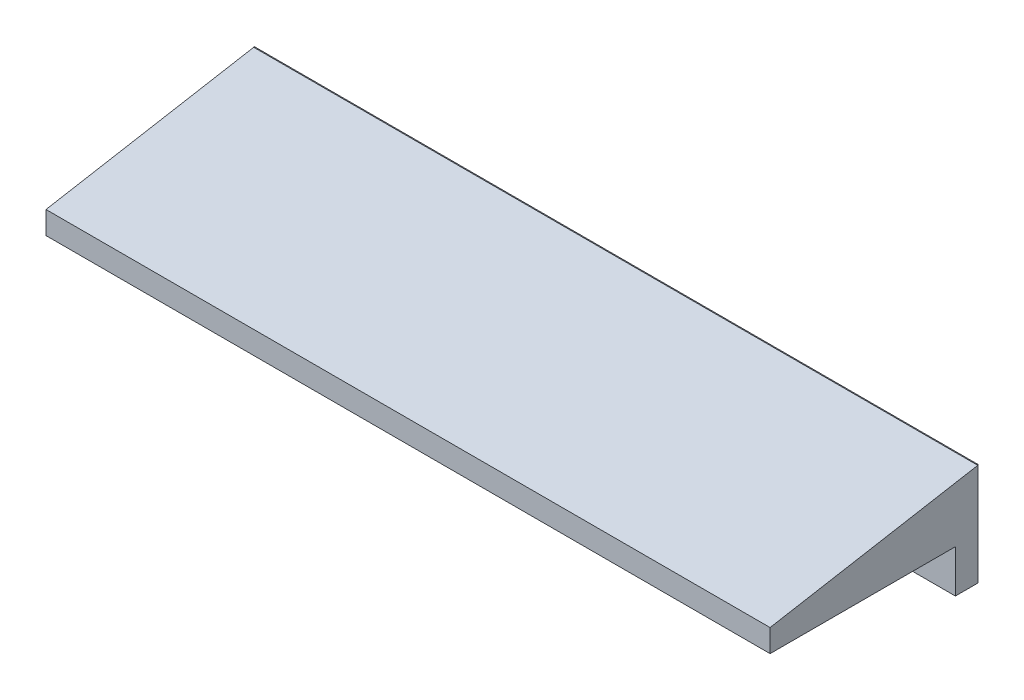
ISO-10303-21;
HEADER;
FILE_DESCRIPTION(('STEP AP214'),'2;1');
FILE_NAME('part.step','',(''),(''),'','','');
FILE_SCHEMA(('AUTOMOTIVE_DESIGN { 1 0 10303 214 1 1 1 1 }'));
ENDSEC;
DATA;
#1=APPLICATION_CONTEXT('core data for automotive mechanical design processes');
#2=APPLICATION_PROTOCOL_DEFINITION('international standard','automotive_design',2000,#1);
#3=PRODUCT_CONTEXT('',#1,'mechanical');
#4=PRODUCT('Part','Part','',(#3));
#5=PRODUCT_RELATED_PRODUCT_CATEGORY('part','',(#4));
#6=PRODUCT_DEFINITION_FORMATION('','',#4);
#7=PRODUCT_DEFINITION_CONTEXT('part definition',#1,'design');
#8=PRODUCT_DEFINITION('design','',#6,#7);
#9=PRODUCT_DEFINITION_SHAPE('','',#8);
#10=(LENGTH_UNIT() NAMED_UNIT(*) SI_UNIT(.MILLI.,.METRE.));
#11=(NAMED_UNIT(*) PLANE_ANGLE_UNIT() SI_UNIT($,.RADIAN.));
#12=(NAMED_UNIT(*) SI_UNIT($,.STERADIAN.) SOLID_ANGLE_UNIT());
#13=UNCERTAINTY_MEASURE_WITH_UNIT(LENGTH_MEASURE(1.E-05),#10,'distance_accuracy_value','');
#14=(GEOMETRIC_REPRESENTATION_CONTEXT(3) GLOBAL_UNCERTAINTY_ASSIGNED_CONTEXT((#13)) GLOBAL_UNIT_ASSIGNED_CONTEXT((#10,
#11,#12)) REPRESENTATION_CONTEXT('',''));
#15=CARTESIAN_POINT('',(0.,0.,0.));
#16=DIRECTION('',(0.,0.,1.));
#17=DIRECTION('',(1.,0.,0.));
#18=AXIS2_PLACEMENT_3D('',#15,#16,#17);
#19=CARTESIAN_POINT('',(50.8,3.175,13.));
#20=DIRECTION('',(-1.,0.,0.));
#21=DIRECTION('',(0.,0.,1.));
#22=AXIS2_PLACEMENT_3D('',#19,#20,#21);
#23=PLANE('',#22);
#24=DIRECTION('',(0.,0.,-1.));
#25=VECTOR('',#24,1.);
#26=CARTESIAN_POINT('',(50.8,0.,13.));
#27=LINE('',#26,#25);
#28=CARTESIAN_POINT('',(50.8,0.,13.));
#29=VERTEX_POINT('',#28);
#30=CARTESIAN_POINT('',(50.8,0.,-13.));
#31=VERTEX_POINT('',#30);
#32=EDGE_CURVE('E80',#29,#31,#27,.T.);
#33=ORIENTED_EDGE('',*,*,#32,.T.);
#34=DIRECTION('',(0.,-1.,0.));
#35=VECTOR('',#34,1.);
#36=CARTESIAN_POINT('',(50.8,3.175,-13.));
#37=LINE('',#36,#35);
#38=CARTESIAN_POINT('',(50.8,-6.,-13.));
#39=VERTEX_POINT('',#38);
#40=EDGE_CURVE('E151',#31,#39,#37,.T.);
#41=ORIENTED_EDGE('',*,*,#40,.T.);
#42=DIRECTION('',(0.,0.,1.));
#43=VECTOR('',#42,1.);
#44=CARTESIAN_POINT('',(50.8,-6.,-16.175));
#45=LINE('',#44,#43);
#46=CARTESIAN_POINT('',(50.8,-6.,-16.175));
#47=VERTEX_POINT('',#46);
#48=EDGE_CURVE('E156',#47,#39,#45,.T.);
#49=ORIENTED_EDGE('',*,*,#48,.F.);
#50=DIRECTION('',(0.,-1.,0.));
#51=VECTOR('',#50,1.);
#52=CARTESIAN_POINT('',(50.8,3.175,-16.175));
#53=LINE('',#52,#51);
#54=CARTESIAN_POINT('',(50.8,8.41281224100232,-16.175));
#55=VERTEX_POINT('',#54);
#56=EDGE_CURVE('E142',#55,#47,#53,.T.);
#57=ORIENTED_EDGE('',*,*,#56,.F.);
#58=DIRECTION('',(0.,-0.952140320589897,0.30566126661219));
#59=VECTOR('',#58,1.);
#60=CARTESIAN_POINT('',(50.8,-3.9214502993643,-12.2153879246706));
#61=LINE('',#60,#59);
#62=CARTESIAN_POINT('',(50.8,8.3137311317087,-16.1431924431629));
#63=VERTEX_POINT('',#62);
#64=EDGE_CURVE('E111',#55,#63,#61,.T.);
#65=ORIENTED_EDGE('',*,*,#64,.T.);
#66=DIRECTION('',(0.,0.173648177666931,-0.984807753012208));
#67=VECTOR('',#66,1.);
#68=CARTESIAN_POINT('',(50.8,5.30239296711449,0.934954942421101));
#69=LINE('',#68,#67);
#70=CARTESIAN_POINT('',(50.8,3.175,13.));
#71=VERTEX_POINT('',#70);
#72=EDGE_CURVE('E91',#71,#63,#69,.T.);
#73=ORIENTED_EDGE('',*,*,#72,.F.);
#74=DIRECTION('',(0.,-1.,0.));
#75=VECTOR('',#74,1.);
#76=CARTESIAN_POINT('',(50.8,3.175,13.));
#77=LINE('',#76,#75);
#78=EDGE_CURVE('E42',#71,#29,#77,.T.);
#79=ORIENTED_EDGE('',*,*,#78,.T.);
#80=EDGE_LOOP('',(#33,#41,#49,#57,#65,#73,#79));
#81=FACE_BOUND('',#80,.T.);
#82=ADVANCED_FACE('F34',(#81),#23,.F.);
#83=CARTESIAN_POINT('',(-50.8,3.175,13.));
#84=DIRECTION('',(1.,0.,0.));
#85=DIRECTION('',(0.,0.,-1.));
#86=AXIS2_PLACEMENT_3D('',#83,#84,#85);
#87=PLANE('',#86);
#88=DIRECTION('',(0.,0.,1.));
#89=VECTOR('',#88,1.);
#90=CARTESIAN_POINT('',(-50.8,0.,13.));
#91=LINE('',#90,#89);
#92=CARTESIAN_POINT('',(-50.8,0.,-13.));
#93=VERTEX_POINT('',#92);
#94=CARTESIAN_POINT('',(-50.8,0.,13.));
#95=VERTEX_POINT('',#94);
#96=EDGE_CURVE('E59',#93,#95,#91,.T.);
#97=ORIENTED_EDGE('',*,*,#96,.T.);
#98=DIRECTION('',(0.,-1.,0.));
#99=VECTOR('',#98,1.);
#100=CARTESIAN_POINT('',(-50.8,3.175,13.));
#101=LINE('',#100,#99);
#102=CARTESIAN_POINT('',(-50.8,3.175,13.));
#103=VERTEX_POINT('',#102);
#104=EDGE_CURVE('E11',#103,#95,#101,.T.);
#105=ORIENTED_EDGE('',*,*,#104,.F.);
#106=DIRECTION('',(0.,0.173648177666931,-0.984807753012208));
#107=VECTOR('',#106,1.);
#108=CARTESIAN_POINT('',(-50.8,5.30239296711449,0.934954942421101));
#109=LINE('',#108,#107);
#110=CARTESIAN_POINT('',(-50.8,8.3137311317087,-16.1431924431629));
#111=VERTEX_POINT('',#110);
#112=EDGE_CURVE('E98',#103,#111,#109,.T.);
#113=ORIENTED_EDGE('',*,*,#112,.T.);
#114=DIRECTION('',(0.,-0.952140320589897,0.30566126661219));
#115=VECTOR('',#114,1.);
#116=CARTESIAN_POINT('',(-50.8,-3.9214502993643,-12.2153879246706));
#117=LINE('',#116,#115);
#118=CARTESIAN_POINT('',(-50.8,8.41281224100232,-16.175));
#119=VERTEX_POINT('',#118);
#120=EDGE_CURVE('E105',#119,#111,#117,.T.);
#121=ORIENTED_EDGE('',*,*,#120,.F.);
#122=DIRECTION('',(0.,1.,0.));
#123=VECTOR('',#122,1.);
#124=CARTESIAN_POINT('',(-50.8,3.175,-16.175));
#125=LINE('',#124,#123);
#126=CARTESIAN_POINT('',(-50.8,-5.99999999999999,-16.175));
#127=VERTEX_POINT('',#126);
#128=EDGE_CURVE('E139',#127,#119,#125,.T.);
#129=ORIENTED_EDGE('',*,*,#128,.F.);
#130=DIRECTION('',(0.,0.,1.));
#131=VECTOR('',#130,1.);
#132=CARTESIAN_POINT('',(-50.8,-5.99999999999999,-16.175));
#133=LINE('',#132,#131);
#134=CARTESIAN_POINT('',(-50.8,-5.99999999999999,-13.));
#135=VERTEX_POINT('',#134);
#136=EDGE_CURVE('E149',#127,#135,#133,.T.);
#137=ORIENTED_EDGE('',*,*,#136,.T.);
#138=DIRECTION('',(0.,1.,0.));
#139=VECTOR('',#138,1.);
#140=CARTESIAN_POINT('',(-50.8,3.175,-13.));
#141=LINE('',#140,#139);
#142=EDGE_CURVE('E63',#135,#93,#141,.T.);
#143=ORIENTED_EDGE('',*,*,#142,.T.);
#144=EDGE_LOOP('',(#97,#105,#113,#121,#129,#137,#143));
#145=FACE_BOUND('',#144,.T.);
#146=ADVANCED_FACE('F60',(#145),#87,.F.);
#147=CARTESIAN_POINT('',(-50.8,3.175,13.));
#148=DIRECTION('',(0.,0.,-1.));
#149=DIRECTION('',(-1.,0.,0.));
#150=AXIS2_PLACEMENT_3D('',#147,#148,#149);
#151=PLANE('',#150);
#152=DIRECTION('',(1.,0.,0.));
#153=VECTOR('',#152,1.);
#154=CARTESIAN_POINT('',(-50.8,0.,13.));
#155=LINE('',#154,#153);
#156=EDGE_CURVE('E67',#95,#29,#155,.T.);
#157=ORIENTED_EDGE('',*,*,#156,.T.);
#158=ORIENTED_EDGE('',*,*,#78,.F.);
#159=DIRECTION('',(1.,0.,0.));
#160=VECTOR('',#159,1.);
#161=CARTESIAN_POINT('',(-50.8,3.175,13.));
#162=LINE('',#161,#160);
#163=EDGE_CURVE('E75',#103,#71,#162,.T.);
#164=ORIENTED_EDGE('',*,*,#163,.F.);
#165=ORIENTED_EDGE('',*,*,#104,.T.);
#166=EDGE_LOOP('',(#157,#158,#164,#165));
#167=FACE_BOUND('',#166,.T.);
#168=ADVANCED_FACE('F71',(#167),#151,.F.);
#169=CARTESIAN_POINT('',(0.,0.,0.));
#170=DIRECTION('',(0.,-1.,0.));
#171=DIRECTION('',(0.,0.,-1.));
#172=AXIS2_PLACEMENT_3D('',#169,#170,#171);
#173=PLANE('',#172);
#174=ORIENTED_EDGE('',*,*,#32,.F.);
#175=ORIENTED_EDGE('',*,*,#156,.F.);
#176=ORIENTED_EDGE('',*,*,#96,.F.);
#177=DIRECTION('',(-1.,0.,0.));
#178=VECTOR('',#177,1.);
#179=CARTESIAN_POINT('',(-50.8,0.,-13.));
#180=LINE('',#179,#178);
#181=EDGE_CURVE('E68',#31,#93,#180,.T.);
#182=ORIENTED_EDGE('',*,*,#181,.F.);
#183=EDGE_LOOP('',(#174,#175,#176,#182));
#184=FACE_BOUND('',#183,.T.);
#185=ADVANCED_FACE('F78',(#184),#173,.T.);
#186=CARTESIAN_POINT('',(-50.8,-5.99999999999999,-16.175));
#187=DIRECTION('',(0.,1.,0.));
#188=DIRECTION('',(-1.,0.,0.));
#189=AXIS2_PLACEMENT_3D('',#186,#187,#188);
#190=PLANE('',#189);
#191=DIRECTION('',(-1.,0.,0.));
#192=VECTOR('',#191,1.);
#193=CARTESIAN_POINT('',(-50.8,-5.99999999999999,-13.));
#194=LINE('',#193,#192);
#195=EDGE_CURVE('E143',#39,#135,#194,.T.);
#196=ORIENTED_EDGE('',*,*,#195,.T.);
#197=ORIENTED_EDGE('',*,*,#136,.F.);
#198=DIRECTION('',(-1.,0.,0.));
#199=VECTOR('',#198,1.);
#200=CARTESIAN_POINT('',(-50.8,-5.99999999999999,-16.175));
#201=LINE('',#200,#199);
#202=EDGE_CURVE('E146',#47,#127,#201,.T.);
#203=ORIENTED_EDGE('',*,*,#202,.F.);
#204=ORIENTED_EDGE('',*,*,#48,.T.);
#205=EDGE_LOOP('',(#196,#197,#203,#204));
#206=FACE_BOUND('',#205,.T.);
#207=ADVANCED_FACE('F173',(#206),#190,.F.);
#208=CARTESIAN_POINT('',(0.,0.,-16.175));
#209=DIRECTION('',(0.,0.,1.));
#210=DIRECTION('',(1.,0.,0.));
#211=AXIS2_PLACEMENT_3D('',#208,#209,#210);
#212=PLANE('',#211);
#213=CARTESIAN_POINT('',(-43.9685,-3.00000000000001,-16.175));
#214=DIRECTION('',(0.,0.,1.));
#215=DIRECTION('',(1.,0.,0.));
#216=AXIS2_PLACEMENT_3D('',#213,#214,#215);
#217=CIRCLE('',#216,1.6);
#218=CARTESIAN_POINT('',(-42.3685,-3.00000000000001,-16.175));
#219=VERTEX_POINT('',#218);
#220=EDGE_CURVE('E116',#219,#219,#217,.T.);
#221=ORIENTED_EDGE('',*,*,#220,.T.);
#222=EDGE_LOOP('',(#221));
#223=FACE_BOUND('',#222,.T.);
#224=CARTESIAN_POINT('',(30.3075,-3.,-16.175));
#225=DIRECTION('',(0.,0.,1.));
#226=DIRECTION('',(1.,0.,0.));
#227=AXIS2_PLACEMENT_3D('',#224,#225,#226);
#228=CIRCLE('',#227,1.6);
#229=CARTESIAN_POINT('',(31.9075,-3.,-16.175));
#230=VERTEX_POINT('',#229);
#231=EDGE_CURVE('E114',#230,#230,#228,.T.);
#232=ORIENTED_EDGE('',*,*,#231,.T.);
#233=EDGE_LOOP('',(#232));
#234=FACE_BOUND('',#233,.T.);
#235=CARTESIAN_POINT('',(43.9685,-3.,-16.175));
#236=DIRECTION('',(0.,0.,1.));
#237=DIRECTION('',(1.,0.,0.));
#238=AXIS2_PLACEMENT_3D('',#235,#236,#237);
#239=CIRCLE('',#238,1.6);
#240=CARTESIAN_POINT('',(45.5685,-3.,-16.175));
#241=VERTEX_POINT('',#240);
#242=EDGE_CURVE('E126',#241,#241,#239,.T.);
#243=ORIENTED_EDGE('',*,*,#242,.T.);
#244=EDGE_LOOP('',(#243));
#245=FACE_BOUND('',#244,.T.);
#246=CARTESIAN_POINT('',(-30.3075,-3.00000000000001,-16.175));
#247=DIRECTION('',(0.,0.,1.));
#248=DIRECTION('',(1.,0.,0.));
#249=AXIS2_PLACEMENT_3D('',#246,#247,#248);
#250=CIRCLE('',#249,1.6);
#251=CARTESIAN_POINT('',(-28.7075,-3.00000000000001,-16.175));
#252=VERTEX_POINT('',#251);
#253=EDGE_CURVE('E131',#252,#252,#250,.T.);
#254=ORIENTED_EDGE('',*,*,#253,.T.);
#255=EDGE_LOOP('',(#254));
#256=FACE_BOUND('',#255,.T.);
#257=ORIENTED_EDGE('',*,*,#128,.T.);
#258=DIRECTION('',(1.,0.,0.));
#259=VECTOR('',#258,1.);
#260=CARTESIAN_POINT('',(-50.8,8.41281224100232,-16.175));
#261=LINE('',#260,#259);
#262=EDGE_CURVE('E104',#119,#55,#261,.T.);
#263=ORIENTED_EDGE('',*,*,#262,.T.);
#264=ORIENTED_EDGE('',*,*,#56,.T.);
#265=ORIENTED_EDGE('',*,*,#202,.T.);
#266=EDGE_LOOP('',(#257,#263,#264,#265));
#267=FACE_BOUND('',#266,.T.);
#268=ADVANCED_FACE('F177',(#223,#234,#245,#256,#267),#212,.F.);
#269=CARTESIAN_POINT('',(0.,0.,-13.));
#270=DIRECTION('',(0.,0.,1.));
#271=DIRECTION('',(1.,0.,0.));
#272=AXIS2_PLACEMENT_3D('',#269,#270,#271);
#273=PLANE('',#272);
#274=CARTESIAN_POINT('',(-43.9685,-3.00000000000001,-13.));
#275=DIRECTION('',(0.,0.,1.));
#276=DIRECTION('',(1.,0.,0.));
#277=AXIS2_PLACEMENT_3D('',#274,#275,#276);
#278=CIRCLE('',#277,1.6);
#279=CARTESIAN_POINT('',(-42.3685,-3.00000000000001,-13.));
#280=VERTEX_POINT('',#279);
#281=EDGE_CURVE('E119',#280,#280,#278,.T.);
#282=ORIENTED_EDGE('',*,*,#281,.F.);
#283=EDGE_LOOP('',(#282));
#284=FACE_BOUND('',#283,.T.);
#285=CARTESIAN_POINT('',(30.3075,-3.,-13.));
#286=DIRECTION('',(0.,0.,1.));
#287=DIRECTION('',(1.,0.,0.));
#288=AXIS2_PLACEMENT_3D('',#285,#286,#287);
#289=CIRCLE('',#288,1.6);
#290=CARTESIAN_POINT('',(31.9075,-3.,-13.));
#291=VERTEX_POINT('',#290);
#292=EDGE_CURVE('E123',#291,#291,#289,.T.);
#293=ORIENTED_EDGE('',*,*,#292,.F.);
#294=EDGE_LOOP('',(#293));
#295=FACE_BOUND('',#294,.T.);
#296=CARTESIAN_POINT('',(43.9685,-3.,-13.));
#297=DIRECTION('',(0.,0.,1.));
#298=DIRECTION('',(1.,0.,0.));
#299=AXIS2_PLACEMENT_3D('',#296,#297,#298);
#300=CIRCLE('',#299,1.6);
#301=CARTESIAN_POINT('',(45.5685,-3.,-13.));
#302=VERTEX_POINT('',#301);
#303=EDGE_CURVE('E134',#302,#302,#300,.T.);
#304=ORIENTED_EDGE('',*,*,#303,.F.);
#305=EDGE_LOOP('',(#304));
#306=FACE_BOUND('',#305,.T.);
#307=CARTESIAN_POINT('',(-30.3075,-3.00000000000001,-13.));
#308=DIRECTION('',(0.,0.,1.));
#309=DIRECTION('',(1.,0.,0.));
#310=AXIS2_PLACEMENT_3D('',#307,#308,#309);
#311=CIRCLE('',#310,1.6);
#312=CARTESIAN_POINT('',(-28.7075,-3.00000000000001,-13.));
#313=VERTEX_POINT('',#312);
#314=EDGE_CURVE('E122',#313,#313,#311,.T.);
#315=ORIENTED_EDGE('',*,*,#314,.F.);
#316=EDGE_LOOP('',(#315));
#317=FACE_BOUND('',#316,.T.);
#318=ORIENTED_EDGE('',*,*,#40,.F.);
#319=ORIENTED_EDGE('',*,*,#181,.T.);
#320=ORIENTED_EDGE('',*,*,#142,.F.);
#321=ORIENTED_EDGE('',*,*,#195,.F.);
#322=EDGE_LOOP('',(#318,#319,#320,#321));
#323=FACE_BOUND('',#322,.T.);
#324=ADVANCED_FACE('F160',(#284,#295,#306,#317,#323),#273,.T.);
#325=CARTESIAN_POINT('',(-30.3075,-3.00000000000001,-16.175));
#326=DIRECTION('',(0.,0.,1.));
#327=DIRECTION('',(1.,0.,0.));
#328=AXIS2_PLACEMENT_3D('',#325,#326,#327);
#329=CYLINDRICAL_SURFACE('',#328,1.6);
#330=ORIENTED_EDGE('',*,*,#253,.F.);
#331=EDGE_LOOP('',(#330));
#332=FACE_BOUND('',#331,.T.);
#333=ORIENTED_EDGE('',*,*,#314,.T.);
#334=EDGE_LOOP('',(#333));
#335=FACE_BOUND('',#334,.T.);
#336=ADVANCED_FACE('F210',(#332,#335),#329,.F.);
#337=CARTESIAN_POINT('',(43.9685,-3.,-16.175));
#338=DIRECTION('',(0.,0.,1.));
#339=DIRECTION('',(1.,0.,0.));
#340=AXIS2_PLACEMENT_3D('',#337,#338,#339);
#341=CYLINDRICAL_SURFACE('',#340,1.6);
#342=ORIENTED_EDGE('',*,*,#242,.F.);
#343=EDGE_LOOP('',(#342));
#344=FACE_BOUND('',#343,.T.);
#345=ORIENTED_EDGE('',*,*,#303,.T.);
#346=EDGE_LOOP('',(#345));
#347=FACE_BOUND('',#346,.T.);
#348=ADVANCED_FACE('F215',(#344,#347),#341,.F.);
#349=CARTESIAN_POINT('',(30.3075,-3.,-16.175));
#350=DIRECTION('',(0.,0.,1.));
#351=DIRECTION('',(1.,0.,0.));
#352=AXIS2_PLACEMENT_3D('',#349,#350,#351);
#353=CYLINDRICAL_SURFACE('',#352,1.6);
#354=ORIENTED_EDGE('',*,*,#231,.F.);
#355=EDGE_LOOP('',(#354));
#356=FACE_BOUND('',#355,.T.);
#357=ORIENTED_EDGE('',*,*,#292,.T.);
#358=EDGE_LOOP('',(#357));
#359=FACE_BOUND('',#358,.T.);
#360=ADVANCED_FACE('F218',(#356,#359),#353,.F.);
#361=CARTESIAN_POINT('',(-43.9685,-3.00000000000001,-16.175));
#362=DIRECTION('',(0.,0.,1.));
#363=DIRECTION('',(1.,0.,0.));
#364=AXIS2_PLACEMENT_3D('',#361,#362,#363);
#365=CYLINDRICAL_SURFACE('',#364,1.6);
#366=ORIENTED_EDGE('',*,*,#220,.F.);
#367=EDGE_LOOP('',(#366));
#368=FACE_BOUND('',#367,.T.);
#369=ORIENTED_EDGE('',*,*,#281,.T.);
#370=EDGE_LOOP('',(#369));
#371=FACE_BOUND('',#370,.T.);
#372=ADVANCED_FACE('F192',(#368,#371),#365,.F.);
#373=CARTESIAN_POINT('',(-50.8,5.30239296711449,0.934954942421101));
#374=DIRECTION('',(0.,-0.984807753012208,-0.173648177666931));
#375=DIRECTION('',(0.,0.173648177666931,-0.984807753012208));
#376=AXIS2_PLACEMENT_3D('',#373,#374,#375);
#377=PLANE('',#376);
#378=ORIENTED_EDGE('',*,*,#72,.T.);
#379=DIRECTION('',(1.,0.,0.));
#380=VECTOR('',#379,1.);
#381=CARTESIAN_POINT('',(-50.8,8.3137311317087,-16.1431924431629));
#382=LINE('',#381,#380);
#383=EDGE_CURVE('E101',#111,#63,#382,.T.);
#384=ORIENTED_EDGE('',*,*,#383,.F.);
#385=ORIENTED_EDGE('',*,*,#112,.F.);
#386=ORIENTED_EDGE('',*,*,#163,.T.);
#387=EDGE_LOOP('',(#378,#384,#385,#386));
#388=FACE_BOUND('',#387,.T.);
#389=ADVANCED_FACE('F96',(#388),#377,.F.);
#390=CARTESIAN_POINT('',(-50.8,-3.9214502993643,-12.2153879246706));
#391=DIRECTION('',(0.,0.30566126661219,0.952140320589897));
#392=DIRECTION('',(0.,-0.952140320589897,0.30566126661219));
#393=AXIS2_PLACEMENT_3D('',#390,#391,#392);
#394=PLANE('',#393);
#395=ORIENTED_EDGE('',*,*,#64,.F.);
#396=ORIENTED_EDGE('',*,*,#262,.F.);
#397=ORIENTED_EDGE('',*,*,#120,.T.);
#398=ORIENTED_EDGE('',*,*,#383,.T.);
#399=EDGE_LOOP('',(#395,#396,#397,#398));
#400=FACE_BOUND('',#399,.T.);
#401=ADVANCED_FACE('F182',(#400),#394,.T.);
#402=CLOSED_SHELL('',(#82,#146,#168,#185,#207,#268,#324,#336,#348,#360,#372,#389,#401));
#403=MANIFOLD_SOLID_BREP('B2',#402);
#404=ADVANCED_BREP_SHAPE_REPRESENTATION('',(#18,#403),#14);
#405=SHAPE_DEFINITION_REPRESENTATION(#9,#404);
ENDSEC;
END-ISO-10303-21;
